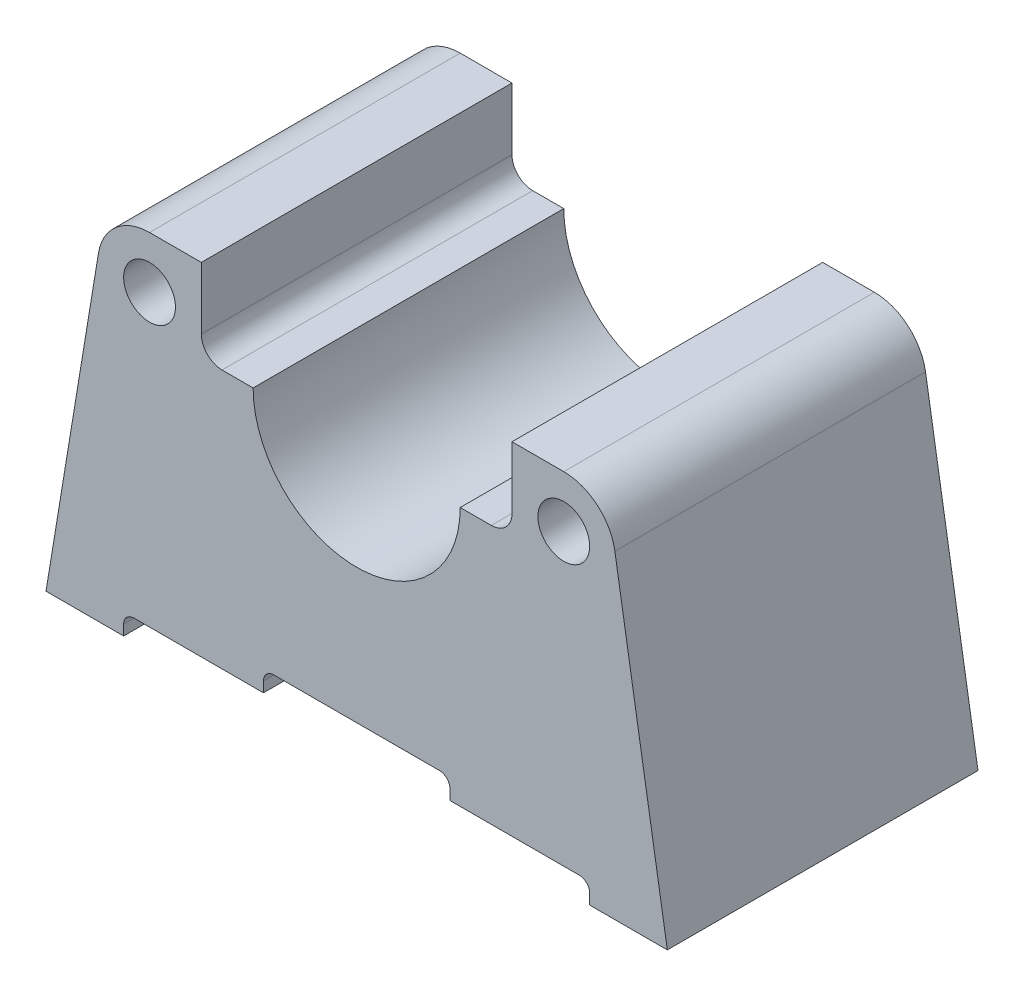
ISO-10303-21;
HEADER;
FILE_DESCRIPTION(('STEP AP214'),'2;1');
FILE_NAME('part.step','',(''),(''),'','','');
FILE_SCHEMA(('AUTOMOTIVE_DESIGN { 1 0 10303 214 1 1 1 1 }'));
ENDSEC;
DATA;
#1=APPLICATION_CONTEXT('core data for automotive mechanical design processes');
#2=APPLICATION_PROTOCOL_DEFINITION('international standard','automotive_design',2000,#1);
#3=PRODUCT_CONTEXT('',#1,'mechanical');
#4=PRODUCT('Part','Part','',(#3));
#5=PRODUCT_RELATED_PRODUCT_CATEGORY('part','',(#4));
#6=PRODUCT_DEFINITION_FORMATION('','',#4);
#7=PRODUCT_DEFINITION_CONTEXT('part definition',#1,'design');
#8=PRODUCT_DEFINITION('design','',#6,#7);
#9=PRODUCT_DEFINITION_SHAPE('','',#8);
#10=(LENGTH_UNIT() NAMED_UNIT(*) SI_UNIT(.MILLI.,.METRE.));
#11=(NAMED_UNIT(*) PLANE_ANGLE_UNIT() SI_UNIT($,.RADIAN.));
#12=(NAMED_UNIT(*) SI_UNIT($,.STERADIAN.) SOLID_ANGLE_UNIT());
#13=UNCERTAINTY_MEASURE_WITH_UNIT(LENGTH_MEASURE(1.E-05),#10,'distance_accuracy_value','');
#14=(GEOMETRIC_REPRESENTATION_CONTEXT(3) GLOBAL_UNCERTAINTY_ASSIGNED_CONTEXT((#13)) GLOBAL_UNIT_ASSIGNED_CONTEXT((#10,
#11,#12)) REPRESENTATION_CONTEXT('',''));
#15=CARTESIAN_POINT('',(0.,0.,0.));
#16=DIRECTION('',(0.,0.,1.));
#17=DIRECTION('',(1.,0.,0.));
#18=AXIS2_PLACEMENT_3D('',#15,#16,#17);
#19=CARTESIAN_POINT('',(20.,30.,30.));
#20=DIRECTION('',(0.,0.,1.));
#21=DIRECTION('',(1.,0.,0.));
#22=AXIS2_PLACEMENT_3D('',#19,#20,#21);
#23=PLANE('',#22);
#24=CARTESIAN_POINT('',(20.,30.,30.));
#25=DIRECTION('',(0.,0.,1.));
#26=DIRECTION('',(1.,0.,0.));
#27=AXIS2_PLACEMENT_3D('',#24,#25,#26);
#28=CIRCLE('',#27,2.5);
#29=CARTESIAN_POINT('',(22.5,30.,30.));
#30=VERTEX_POINT('',#29);
#31=EDGE_CURVE('E246',#30,#30,#28,.T.);
#32=ORIENTED_EDGE('',*,*,#31,.F.);
#33=EDGE_LOOP('',(#32));
#34=FACE_BOUND('',#33,.T.);
#35=DIRECTION('',(1.,0.,0.));
#36=VECTOR('',#35,1.);
#37=CARTESIAN_POINT('',(22.5,0.,30.));
#38=LINE('',#37,#36);
#39=CARTESIAN_POINT('',(22.5,0.,30.));
#40=VERTEX_POINT('',#39);
#41=CARTESIAN_POINT('',(30.,0.,30.));
#42=VERTEX_POINT('',#41);
#43=EDGE_CURVE('E293',#40,#42,#38,.T.);
#44=ORIENTED_EDGE('',*,*,#43,.T.);
#45=DIRECTION('',(-0.16224989991992,0.98674969975976,0.));
#46=VECTOR('',#45,1.);
#47=CARTESIAN_POINT('',(30.,0.,30.));
#48=LINE('',#47,#46);
#49=CARTESIAN_POINT('',(24.9337484987988,30.8112494995996,30.));
#50=VERTEX_POINT('',#49);
#51=EDGE_CURVE('E151',#42,#50,#48,.T.);
#52=ORIENTED_EDGE('',*,*,#51,.T.);
#53=CARTESIAN_POINT('',(20.,30.,30.));
#54=DIRECTION('',(0.,0.,1.));
#55=DIRECTION('',(1.,0.,0.));
#56=AXIS2_PLACEMENT_3D('',#53,#54,#55);
#57=CIRCLE('',#56,5.);
#58=CARTESIAN_POINT('',(20.,35.,30.));
#59=VERTEX_POINT('',#58);
#60=EDGE_CURVE('E362',#50,#59,#57,.T.);
#61=ORIENTED_EDGE('',*,*,#60,.T.);
#62=DIRECTION('',(-1.,0.,0.));
#63=VECTOR('',#62,1.);
#64=CARTESIAN_POINT('',(20.,35.,30.));
#65=LINE('',#64,#63);
#66=CARTESIAN_POINT('',(15.,35.,30.));
#67=VERTEX_POINT('',#66);
#68=EDGE_CURVE('E381',#59,#67,#65,.T.);
#69=ORIENTED_EDGE('',*,*,#68,.T.);
#70=DIRECTION('',(0.,-1.,0.));
#71=VECTOR('',#70,1.);
#72=CARTESIAN_POINT('',(15.,35.,30.));
#73=LINE('',#72,#71);
#74=CARTESIAN_POINT('',(15.,29.,30.));
#75=VERTEX_POINT('',#74);
#76=EDGE_CURVE('E378',#67,#75,#73,.T.);
#77=ORIENTED_EDGE('',*,*,#76,.T.);
#78=CARTESIAN_POINT('',(13.,29.,30.));
#79=DIRECTION('',(0.,0.,-1.));
#80=DIRECTION('',(-1.,0.,0.));
#81=AXIS2_PLACEMENT_3D('',#78,#79,#80);
#82=CIRCLE('',#81,2.);
#83=CARTESIAN_POINT('',(13.,27.,30.));
#84=VERTEX_POINT('',#83);
#85=EDGE_CURVE('E380',#75,#84,#82,.T.);
#86=ORIENTED_EDGE('',*,*,#85,.T.);
#87=DIRECTION('',(-1.,0.,0.));
#88=VECTOR('',#87,1.);
#89=CARTESIAN_POINT('',(13.,27.,30.));
#90=LINE('',#89,#88);
#91=CARTESIAN_POINT('',(10.,27.,30.));
#92=VERTEX_POINT('',#91);
#93=EDGE_CURVE('E383',#84,#92,#90,.T.);
#94=ORIENTED_EDGE('',*,*,#93,.T.);
#95=CARTESIAN_POINT('',(0.,27.,30.));
#96=DIRECTION('',(0.,0.,-1.));
#97=DIRECTION('',(-1.,0.,0.));
#98=AXIS2_PLACEMENT_3D('',#95,#96,#97);
#99=CIRCLE('',#98,10.);
#100=CARTESIAN_POINT('',(-10.,27.,30.));
#101=VERTEX_POINT('',#100);
#102=EDGE_CURVE('E389',#92,#101,#99,.T.);
#103=ORIENTED_EDGE('',*,*,#102,.T.);
#104=DIRECTION('',(-1.,0.,0.));
#105=VECTOR('',#104,1.);
#106=CARTESIAN_POINT('',(-13.,27.,30.));
#107=LINE('',#106,#105);
#108=CARTESIAN_POINT('',(-13.,27.,30.));
#109=VERTEX_POINT('',#108);
#110=EDGE_CURVE('E391',#101,#109,#107,.T.);
#111=ORIENTED_EDGE('',*,*,#110,.T.);
#112=CARTESIAN_POINT('',(-13.,29.,30.));
#113=DIRECTION('',(0.,0.,-1.));
#114=DIRECTION('',(-1.,0.,0.));
#115=AXIS2_PLACEMENT_3D('',#112,#113,#114);
#116=CIRCLE('',#115,2.);
#117=CARTESIAN_POINT('',(-15.,29.,30.));
#118=VERTEX_POINT('',#117);
#119=EDGE_CURVE('E393',#109,#118,#116,.T.);
#120=ORIENTED_EDGE('',*,*,#119,.T.);
#121=DIRECTION('',(0.,1.,0.));
#122=VECTOR('',#121,1.);
#123=CARTESIAN_POINT('',(-15.,35.,30.));
#124=LINE('',#123,#122);
#125=CARTESIAN_POINT('',(-15.,35.,30.));
#126=VERTEX_POINT('',#125);
#127=EDGE_CURVE('E395',#118,#126,#124,.T.);
#128=ORIENTED_EDGE('',*,*,#127,.T.);
#129=DIRECTION('',(-1.,0.,0.));
#130=VECTOR('',#129,1.);
#131=CARTESIAN_POINT('',(-20.,35.,30.));
#132=LINE('',#131,#130);
#133=CARTESIAN_POINT('',(-20.,35.,30.));
#134=VERTEX_POINT('',#133);
#135=EDGE_CURVE('E397',#126,#134,#132,.T.);
#136=ORIENTED_EDGE('',*,*,#135,.T.);
#137=CARTESIAN_POINT('',(-20.,30.,30.));
#138=DIRECTION('',(0.,0.,1.));
#139=DIRECTION('',(1.,0.,0.));
#140=AXIS2_PLACEMENT_3D('',#137,#138,#139);
#141=CIRCLE('',#140,5.);
#142=CARTESIAN_POINT('',(-24.9337484987988,30.8112494995996,30.));
#143=VERTEX_POINT('',#142);
#144=EDGE_CURVE('E399',#134,#143,#141,.T.);
#145=ORIENTED_EDGE('',*,*,#144,.T.);
#146=DIRECTION('',(-0.16224989991992,-0.98674969975976,0.));
#147=VECTOR('',#146,1.);
#148=CARTESIAN_POINT('',(-30.,0.,30.));
#149=LINE('',#148,#147);
#150=CARTESIAN_POINT('',(-30.,0.,30.));
#151=VERTEX_POINT('',#150);
#152=EDGE_CURVE('E401',#143,#151,#149,.T.);
#153=ORIENTED_EDGE('',*,*,#152,.T.);
#154=DIRECTION('',(1.,0.,0.));
#155=VECTOR('',#154,1.);
#156=CARTESIAN_POINT('',(-22.5,0.,30.));
#157=LINE('',#156,#155);
#158=CARTESIAN_POINT('',(-22.5,0.,30.));
#159=VERTEX_POINT('',#158);
#160=EDGE_CURVE('E403',#151,#159,#157,.T.);
#161=ORIENTED_EDGE('',*,*,#160,.T.);
#162=DIRECTION('',(0.,1.,0.));
#163=VECTOR('',#162,1.);
#164=CARTESIAN_POINT('',(-22.5,0.999999999999993,30.));
#165=LINE('',#164,#163);
#166=CARTESIAN_POINT('',(-22.5,0.999999999999993,30.));
#167=VERTEX_POINT('',#166);
#168=EDGE_CURVE('E405',#159,#167,#165,.T.);
#169=ORIENTED_EDGE('',*,*,#168,.T.);
#170=CARTESIAN_POINT('',(-21.5,1.,30.));
#171=DIRECTION('',(0.,0.,-1.));
#172=DIRECTION('',(-1.,0.,0.));
#173=AXIS2_PLACEMENT_3D('',#170,#171,#172);
#174=CIRCLE('',#173,1.);
#175=CARTESIAN_POINT('',(-21.5,2.,30.));
#176=VERTEX_POINT('',#175);
#177=EDGE_CURVE('E407',#167,#176,#174,.T.);
#178=ORIENTED_EDGE('',*,*,#177,.T.);
#179=DIRECTION('',(1.,0.,0.));
#180=VECTOR('',#179,1.);
#181=CARTESIAN_POINT('',(-9.,2.,30.));
#182=LINE('',#181,#180);
#183=CARTESIAN_POINT('',(-9.,2.,30.));
#184=VERTEX_POINT('',#183);
#185=EDGE_CURVE('E409',#176,#184,#182,.T.);
#186=ORIENTED_EDGE('',*,*,#185,.T.);
#187=DIRECTION('',(0.,1.,0.));
#188=VECTOR('',#187,1.);
#189=CARTESIAN_POINT('',(-9.,2.99999999999999,30.));
#190=LINE('',#189,#188);
#191=CARTESIAN_POINT('',(-9.,2.99999999999999,30.));
#192=VERTEX_POINT('',#191);
#193=EDGE_CURVE('E411',#184,#192,#190,.T.);
#194=ORIENTED_EDGE('',*,*,#193,.T.);
#195=CARTESIAN_POINT('',(-8.,3.,30.));
#196=DIRECTION('',(0.,0.,-1.));
#197=DIRECTION('',(-1.,0.,0.));
#198=AXIS2_PLACEMENT_3D('',#195,#196,#197);
#199=CIRCLE('',#198,1.);
#200=CARTESIAN_POINT('',(-7.99999999999999,4.,30.));
#201=VERTEX_POINT('',#200);
#202=EDGE_CURVE('E413',#192,#201,#199,.T.);
#203=ORIENTED_EDGE('',*,*,#202,.T.);
#204=DIRECTION('',(1.,0.,0.));
#205=VECTOR('',#204,1.);
#206=CARTESIAN_POINT('',(-7.99999999999999,4.,30.));
#207=LINE('',#206,#205);
#208=CARTESIAN_POINT('',(7.99999999999999,4.,30.));
#209=VERTEX_POINT('',#208);
#210=EDGE_CURVE('E415',#201,#209,#207,.T.);
#211=ORIENTED_EDGE('',*,*,#210,.T.);
#212=CARTESIAN_POINT('',(8.,3.,30.));
#213=DIRECTION('',(0.,0.,-1.));
#214=DIRECTION('',(-1.,0.,0.));
#215=AXIS2_PLACEMENT_3D('',#212,#213,#214);
#216=CIRCLE('',#215,1.);
#217=CARTESIAN_POINT('',(9.,2.99999999999999,30.));
#218=VERTEX_POINT('',#217);
#219=EDGE_CURVE('E417',#209,#218,#216,.T.);
#220=ORIENTED_EDGE('',*,*,#219,.T.);
#221=DIRECTION('',(0.,-1.,0.));
#222=VECTOR('',#221,1.);
#223=CARTESIAN_POINT('',(9.,2.99999999999999,30.));
#224=LINE('',#223,#222);
#225=CARTESIAN_POINT('',(9.,2.,30.));
#226=VERTEX_POINT('',#225);
#227=EDGE_CURVE('E224',#218,#226,#224,.T.);
#228=ORIENTED_EDGE('',*,*,#227,.T.);
#229=DIRECTION('',(1.,0.,0.));
#230=VECTOR('',#229,1.);
#231=CARTESIAN_POINT('',(9.,2.,30.));
#232=LINE('',#231,#230);
#233=CARTESIAN_POINT('',(21.5,2.,30.));
#234=VERTEX_POINT('',#233);
#235=EDGE_CURVE('E218',#226,#234,#232,.T.);
#236=ORIENTED_EDGE('',*,*,#235,.T.);
#237=CARTESIAN_POINT('',(21.5,1.,30.));
#238=DIRECTION('',(0.,0.,-1.));
#239=DIRECTION('',(-1.,0.,0.));
#240=AXIS2_PLACEMENT_3D('',#237,#238,#239);
#241=CIRCLE('',#240,1.);
#242=CARTESIAN_POINT('',(22.5,0.999999999999993,30.));
#243=VERTEX_POINT('',#242);
#244=EDGE_CURVE('E222',#234,#243,#241,.T.);
#245=ORIENTED_EDGE('',*,*,#244,.T.);
#246=DIRECTION('',(0.,-1.,0.));
#247=VECTOR('',#246,1.);
#248=CARTESIAN_POINT('',(22.5,0.999999999999993,30.));
#249=LINE('',#248,#247);
#250=EDGE_CURVE('E54',#243,#40,#249,.T.);
#251=ORIENTED_EDGE('',*,*,#250,.T.);
#252=EDGE_LOOP('',(#44,#52,#61,#69,#77,#86,#94,#103,#111,#120,#128,#136,#145,#153,#161,#169,
#178,#186,#194,#203,#211,#220,#228,#236,#245,#251));
#253=FACE_BOUND('',#252,.T.);
#254=CARTESIAN_POINT('',(-20.,30.,30.));
#255=DIRECTION('',(0.,0.,1.));
#256=DIRECTION('',(1.,0.,0.));
#257=AXIS2_PLACEMENT_3D('',#254,#255,#256);
#258=CIRCLE('',#257,2.5);
#259=CARTESIAN_POINT('',(-17.5,30.,30.));
#260=VERTEX_POINT('',#259);
#261=EDGE_CURVE('E459',#260,#260,#258,.T.);
#262=ORIENTED_EDGE('',*,*,#261,.F.);
#263=EDGE_LOOP('',(#262));
#264=FACE_BOUND('',#263,.T.);
#265=ADVANCED_FACE('F37',(#34,#253,#264),#23,.T.);
#266=CARTESIAN_POINT('',(20.,30.,0.));
#267=DIRECTION('',(0.,0.,1.));
#268=DIRECTION('',(1.,0.,0.));
#269=AXIS2_PLACEMENT_3D('',#266,#267,#268);
#270=PLANE('',#269);
#271=DIRECTION('',(1.,0.,0.));
#272=VECTOR('',#271,1.);
#273=CARTESIAN_POINT('',(22.5,0.,0.));
#274=LINE('',#273,#272);
#275=CARTESIAN_POINT('',(22.5,0.,0.));
#276=VERTEX_POINT('',#275);
#277=CARTESIAN_POINT('',(30.,0.,0.));
#278=VERTEX_POINT('',#277);
#279=EDGE_CURVE('E242',#276,#278,#274,.T.);
#280=ORIENTED_EDGE('',*,*,#279,.F.);
#281=DIRECTION('',(0.,-1.,0.));
#282=VECTOR('',#281,1.);
#283=CARTESIAN_POINT('',(22.5,0.999999999999993,0.));
#284=LINE('',#283,#282);
#285=CARTESIAN_POINT('',(22.5,0.999999999999993,0.));
#286=VERTEX_POINT('',#285);
#287=EDGE_CURVE('E143',#286,#276,#284,.T.);
#288=ORIENTED_EDGE('',*,*,#287,.F.);
#289=CARTESIAN_POINT('',(21.5,1.,0.));
#290=DIRECTION('',(0.,0.,-1.));
#291=DIRECTION('',(-1.,0.,0.));
#292=AXIS2_PLACEMENT_3D('',#289,#290,#291);
#293=CIRCLE('',#292,1.);
#294=CARTESIAN_POINT('',(21.5,2.,0.));
#295=VERTEX_POINT('',#294);
#296=EDGE_CURVE('E137',#295,#286,#293,.T.);
#297=ORIENTED_EDGE('',*,*,#296,.F.);
#298=DIRECTION('',(1.,0.,0.));
#299=VECTOR('',#298,1.);
#300=CARTESIAN_POINT('',(9.,2.,0.));
#301=LINE('',#300,#299);
#302=CARTESIAN_POINT('',(9.,2.,0.));
#303=VERTEX_POINT('',#302);
#304=EDGE_CURVE('E232',#303,#295,#301,.T.);
#305=ORIENTED_EDGE('',*,*,#304,.F.);
#306=DIRECTION('',(0.,-1.,0.));
#307=VECTOR('',#306,1.);
#308=CARTESIAN_POINT('',(9.,2.99999999999999,0.));
#309=LINE('',#308,#307);
#310=CARTESIAN_POINT('',(9.,2.99999999999999,0.));
#311=VERTEX_POINT('',#310);
#312=EDGE_CURVE('E288',#311,#303,#309,.T.);
#313=ORIENTED_EDGE('',*,*,#312,.F.);
#314=CARTESIAN_POINT('',(8.,3.,0.));
#315=DIRECTION('',(0.,0.,-1.));
#316=DIRECTION('',(-1.,0.,0.));
#317=AXIS2_PLACEMENT_3D('',#314,#315,#316);
#318=CIRCLE('',#317,1.);
#319=CARTESIAN_POINT('',(7.99999999999999,4.,0.));
#320=VERTEX_POINT('',#319);
#321=EDGE_CURVE('E286',#320,#311,#318,.T.);
#322=ORIENTED_EDGE('',*,*,#321,.F.);
#323=DIRECTION('',(1.,0.,0.));
#324=VECTOR('',#323,1.);
#325=CARTESIAN_POINT('',(-7.99999999999999,4.,0.));
#326=LINE('',#325,#324);
#327=CARTESIAN_POINT('',(-7.99999999999999,4.,0.));
#328=VERTEX_POINT('',#327);
#329=EDGE_CURVE('E284',#328,#320,#326,.T.);
#330=ORIENTED_EDGE('',*,*,#329,.F.);
#331=CARTESIAN_POINT('',(-8.,3.,0.));
#332=DIRECTION('',(0.,0.,-1.));
#333=DIRECTION('',(-1.,0.,0.));
#334=AXIS2_PLACEMENT_3D('',#331,#332,#333);
#335=CIRCLE('',#334,1.);
#336=CARTESIAN_POINT('',(-9.,2.99999999999999,0.));
#337=VERTEX_POINT('',#336);
#338=EDGE_CURVE('E282',#337,#328,#335,.T.);
#339=ORIENTED_EDGE('',*,*,#338,.F.);
#340=DIRECTION('',(0.,1.,0.));
#341=VECTOR('',#340,1.);
#342=CARTESIAN_POINT('',(-9.,2.99999999999999,0.));
#343=LINE('',#342,#341);
#344=CARTESIAN_POINT('',(-9.,2.,0.));
#345=VERTEX_POINT('',#344);
#346=EDGE_CURVE('E280',#345,#337,#343,.T.);
#347=ORIENTED_EDGE('',*,*,#346,.F.);
#348=DIRECTION('',(1.,0.,0.));
#349=VECTOR('',#348,1.);
#350=CARTESIAN_POINT('',(-9.,2.,0.));
#351=LINE('',#350,#349);
#352=CARTESIAN_POINT('',(-21.5,2.,0.));
#353=VERTEX_POINT('',#352);
#354=EDGE_CURVE('E278',#353,#345,#351,.T.);
#355=ORIENTED_EDGE('',*,*,#354,.F.);
#356=CARTESIAN_POINT('',(-21.5,1.,0.));
#357=DIRECTION('',(0.,0.,-1.));
#358=DIRECTION('',(-1.,0.,0.));
#359=AXIS2_PLACEMENT_3D('',#356,#357,#358);
#360=CIRCLE('',#359,1.);
#361=CARTESIAN_POINT('',(-22.5,0.999999999999993,0.));
#362=VERTEX_POINT('',#361);
#363=EDGE_CURVE('E276',#362,#353,#360,.T.);
#364=ORIENTED_EDGE('',*,*,#363,.F.);
#365=DIRECTION('',(0.,1.,0.));
#366=VECTOR('',#365,1.);
#367=CARTESIAN_POINT('',(-22.5,0.999999999999993,0.));
#368=LINE('',#367,#366);
#369=CARTESIAN_POINT('',(-22.5,0.,0.));
#370=VERTEX_POINT('',#369);
#371=EDGE_CURVE('E274',#370,#362,#368,.T.);
#372=ORIENTED_EDGE('',*,*,#371,.F.);
#373=DIRECTION('',(1.,0.,0.));
#374=VECTOR('',#373,1.);
#375=CARTESIAN_POINT('',(-22.5,0.,0.));
#376=LINE('',#375,#374);
#377=CARTESIAN_POINT('',(-30.,0.,0.));
#378=VERTEX_POINT('',#377);
#379=EDGE_CURVE('E272',#378,#370,#376,.T.);
#380=ORIENTED_EDGE('',*,*,#379,.F.);
#381=DIRECTION('',(-0.16224989991992,-0.98674969975976,0.));
#382=VECTOR('',#381,1.);
#383=CARTESIAN_POINT('',(-30.,0.,0.));
#384=LINE('',#383,#382);
#385=CARTESIAN_POINT('',(-24.9337484987988,30.8112494995996,0.));
#386=VERTEX_POINT('',#385);
#387=EDGE_CURVE('E270',#386,#378,#384,.T.);
#388=ORIENTED_EDGE('',*,*,#387,.F.);
#389=CARTESIAN_POINT('',(-20.,30.,0.));
#390=DIRECTION('',(0.,0.,1.));
#391=DIRECTION('',(1.,0.,0.));
#392=AXIS2_PLACEMENT_3D('',#389,#390,#391);
#393=CIRCLE('',#392,5.);
#394=CARTESIAN_POINT('',(-20.,35.,0.));
#395=VERTEX_POINT('',#394);
#396=EDGE_CURVE('E268',#395,#386,#393,.T.);
#397=ORIENTED_EDGE('',*,*,#396,.F.);
#398=DIRECTION('',(-1.,0.,0.));
#399=VECTOR('',#398,1.);
#400=CARTESIAN_POINT('',(-20.,35.,0.));
#401=LINE('',#400,#399);
#402=CARTESIAN_POINT('',(-15.,35.,0.));
#403=VERTEX_POINT('',#402);
#404=EDGE_CURVE('E266',#403,#395,#401,.T.);
#405=ORIENTED_EDGE('',*,*,#404,.F.);
#406=DIRECTION('',(0.,1.,0.));
#407=VECTOR('',#406,1.);
#408=CARTESIAN_POINT('',(-15.,35.,0.));
#409=LINE('',#408,#407);
#410=CARTESIAN_POINT('',(-15.,29.,0.));
#411=VERTEX_POINT('',#410);
#412=EDGE_CURVE('E264',#411,#403,#409,.T.);
#413=ORIENTED_EDGE('',*,*,#412,.F.);
#414=CARTESIAN_POINT('',(-13.,29.,0.));
#415=DIRECTION('',(0.,0.,-1.));
#416=DIRECTION('',(-1.,0.,0.));
#417=AXIS2_PLACEMENT_3D('',#414,#415,#416);
#418=CIRCLE('',#417,2.);
#419=CARTESIAN_POINT('',(-13.,27.,0.));
#420=VERTEX_POINT('',#419);
#421=EDGE_CURVE('E262',#420,#411,#418,.T.);
#422=ORIENTED_EDGE('',*,*,#421,.F.);
#423=DIRECTION('',(-1.,0.,0.));
#424=VECTOR('',#423,1.);
#425=CARTESIAN_POINT('',(-13.,27.,0.));
#426=LINE('',#425,#424);
#427=CARTESIAN_POINT('',(-10.,27.,0.));
#428=VERTEX_POINT('',#427);
#429=EDGE_CURVE('E260',#428,#420,#426,.T.);
#430=ORIENTED_EDGE('',*,*,#429,.F.);
#431=CARTESIAN_POINT('',(0.,27.,0.));
#432=DIRECTION('',(0.,0.,-1.));
#433=DIRECTION('',(-1.,0.,0.));
#434=AXIS2_PLACEMENT_3D('',#431,#432,#433);
#435=CIRCLE('',#434,10.);
#436=CARTESIAN_POINT('',(10.,27.,0.));
#437=VERTEX_POINT('',#436);
#438=EDGE_CURVE('E258',#437,#428,#435,.T.);
#439=ORIENTED_EDGE('',*,*,#438,.F.);
#440=DIRECTION('',(-1.,0.,0.));
#441=VECTOR('',#440,1.);
#442=CARTESIAN_POINT('',(13.,27.,0.));
#443=LINE('',#442,#441);
#444=CARTESIAN_POINT('',(13.,27.,0.));
#445=VERTEX_POINT('',#444);
#446=EDGE_CURVE('E256',#445,#437,#443,.T.);
#447=ORIENTED_EDGE('',*,*,#446,.F.);
#448=CARTESIAN_POINT('',(13.,29.,0.));
#449=DIRECTION('',(0.,0.,-1.));
#450=DIRECTION('',(-1.,0.,0.));
#451=AXIS2_PLACEMENT_3D('',#448,#449,#450);
#452=CIRCLE('',#451,2.);
#453=CARTESIAN_POINT('',(15.,29.,0.));
#454=VERTEX_POINT('',#453);
#455=EDGE_CURVE('E254',#454,#445,#452,.T.);
#456=ORIENTED_EDGE('',*,*,#455,.F.);
#457=DIRECTION('',(0.,-1.,0.));
#458=VECTOR('',#457,1.);
#459=CARTESIAN_POINT('',(15.,35.,0.));
#460=LINE('',#459,#458);
#461=CARTESIAN_POINT('',(15.,35.,0.));
#462=VERTEX_POINT('',#461);
#463=EDGE_CURVE('E252',#462,#454,#460,.T.);
#464=ORIENTED_EDGE('',*,*,#463,.F.);
#465=DIRECTION('',(-1.,0.,0.));
#466=VECTOR('',#465,1.);
#467=CARTESIAN_POINT('',(20.,35.,0.));
#468=LINE('',#467,#466);
#469=CARTESIAN_POINT('',(20.,35.,0.));
#470=VERTEX_POINT('',#469);
#471=EDGE_CURVE('E250',#470,#462,#468,.T.);
#472=ORIENTED_EDGE('',*,*,#471,.F.);
#473=CARTESIAN_POINT('',(20.,30.,0.));
#474=DIRECTION('',(0.,0.,1.));
#475=DIRECTION('',(1.,0.,0.));
#476=AXIS2_PLACEMENT_3D('',#473,#474,#475);
#477=CIRCLE('',#476,5.);
#478=CARTESIAN_POINT('',(24.9337484987988,30.8112494995996,0.));
#479=VERTEX_POINT('',#478);
#480=EDGE_CURVE('E248',#479,#470,#477,.T.);
#481=ORIENTED_EDGE('',*,*,#480,.F.);
#482=DIRECTION('',(-0.16224989991992,0.98674969975976,0.));
#483=VECTOR('',#482,1.);
#484=CARTESIAN_POINT('',(30.,0.,0.));
#485=LINE('',#484,#483);
#486=EDGE_CURVE('E245',#278,#479,#485,.T.);
#487=ORIENTED_EDGE('',*,*,#486,.F.);
#488=EDGE_LOOP('',(#280,#288,#297,#305,#313,#322,#330,#339,#347,#355,#364,#372,#380,#388,#397,
#405,#413,#422,#430,#439,#447,#456,#464,#472,#481,#487));
#489=FACE_BOUND('',#488,.T.);
#490=CARTESIAN_POINT('',(20.,30.,0.));
#491=DIRECTION('',(0.,0.,1.));
#492=DIRECTION('',(1.,0.,0.));
#493=AXIS2_PLACEMENT_3D('',#490,#491,#492);
#494=CIRCLE('',#493,2.5);
#495=CARTESIAN_POINT('',(22.5,30.,0.));
#496=VERTEX_POINT('',#495);
#497=EDGE_CURVE('E465',#496,#496,#494,.T.);
#498=ORIENTED_EDGE('',*,*,#497,.T.);
#499=EDGE_LOOP('',(#498));
#500=FACE_BOUND('',#499,.T.);
#501=CARTESIAN_POINT('',(-20.,30.,0.));
#502=DIRECTION('',(0.,0.,1.));
#503=DIRECTION('',(1.,0.,0.));
#504=AXIS2_PLACEMENT_3D('',#501,#502,#503);
#505=CIRCLE('',#504,2.5);
#506=CARTESIAN_POINT('',(-17.5,30.,0.));
#507=VERTEX_POINT('',#506);
#508=EDGE_CURVE('E462',#507,#507,#505,.T.);
#509=ORIENTED_EDGE('',*,*,#508,.T.);
#510=EDGE_LOOP('',(#509));
#511=FACE_BOUND('',#510,.T.);
#512=ADVANCED_FACE('F366',(#489,#500,#511),#270,.F.);
#513=CARTESIAN_POINT('',(22.5,0.,30.));
#514=DIRECTION('',(0.,1.,0.));
#515=DIRECTION('',(-1.,0.,0.));
#516=AXIS2_PLACEMENT_3D('',#513,#514,#515);
#517=PLANE('',#516);
#518=ORIENTED_EDGE('',*,*,#279,.T.);
#519=DIRECTION('',(0.,0.,-1.));
#520=VECTOR('',#519,1.);
#521=CARTESIAN_POINT('',(30.,0.,30.));
#522=LINE('',#521,#520);
#523=EDGE_CURVE('E11',#42,#278,#522,.T.);
#524=ORIENTED_EDGE('',*,*,#523,.F.);
#525=ORIENTED_EDGE('',*,*,#43,.F.);
#526=DIRECTION('',(0.,0.,-1.));
#527=VECTOR('',#526,1.);
#528=CARTESIAN_POINT('',(22.5,0.,30.));
#529=LINE('',#528,#527);
#530=EDGE_CURVE('E238',#40,#276,#529,.T.);
#531=ORIENTED_EDGE('',*,*,#530,.T.);
#532=EDGE_LOOP('',(#518,#524,#525,#531));
#533=FACE_BOUND('',#532,.T.);
#534=ADVANCED_FACE('F39',(#533),#517,.F.);
#535=CARTESIAN_POINT('',(30.,0.,30.));
#536=DIRECTION('',(-0.98674969975976,-0.16224989991992,0.));
#537=DIRECTION('',(0.16224989991992,-0.98674969975976,0.));
#538=AXIS2_PLACEMENT_3D('',#535,#536,#537);
#539=PLANE('',#538);
#540=ORIENTED_EDGE('',*,*,#486,.T.);
#541=DIRECTION('',(0.,0.,-1.));
#542=VECTOR('',#541,1.);
#543=CARTESIAN_POINT('',(24.9337484987988,30.8112494995996,30.));
#544=LINE('',#543,#542);
#545=EDGE_CURVE('E46',#50,#479,#544,.T.);
#546=ORIENTED_EDGE('',*,*,#545,.F.);
#547=ORIENTED_EDGE('',*,*,#51,.F.);
#548=ORIENTED_EDGE('',*,*,#523,.T.);
#549=EDGE_LOOP('',(#540,#546,#547,#548));
#550=FACE_BOUND('',#549,.T.);
#551=ADVANCED_FACE('F722',(#550),#539,.F.);
#552=CARTESIAN_POINT('',(20.,30.,30.));
#553=DIRECTION('',(0.,0.,-1.));
#554=DIRECTION('',(-1.,0.,0.));
#555=AXIS2_PLACEMENT_3D('',#552,#553,#554);
#556=CYLINDRICAL_SURFACE('',#555,5.);
#557=ORIENTED_EDGE('',*,*,#480,.T.);
#558=DIRECTION('',(0.,0.,-1.));
#559=VECTOR('',#558,1.);
#560=CARTESIAN_POINT('',(20.,35.,30.));
#561=LINE('',#560,#559);
#562=EDGE_CURVE('E354',#59,#470,#561,.T.);
#563=ORIENTED_EDGE('',*,*,#562,.F.);
#564=ORIENTED_EDGE('',*,*,#60,.F.);
#565=ORIENTED_EDGE('',*,*,#545,.T.);
#566=EDGE_LOOP('',(#557,#563,#564,#565));
#567=FACE_BOUND('',#566,.T.);
#568=ADVANCED_FACE('F360',(#567),#556,.T.);
#569=CARTESIAN_POINT('',(20.,35.,30.));
#570=DIRECTION('',(0.,-1.,0.));
#571=DIRECTION('',(0.,0.,-1.));
#572=AXIS2_PLACEMENT_3D('',#569,#570,#571);
#573=PLANE('',#572);
#574=ORIENTED_EDGE('',*,*,#471,.T.);
#575=DIRECTION('',(0.,0.,-1.));
#576=VECTOR('',#575,1.);
#577=CARTESIAN_POINT('',(15.,35.,30.));
#578=LINE('',#577,#576);
#579=EDGE_CURVE('E351',#67,#462,#578,.T.);
#580=ORIENTED_EDGE('',*,*,#579,.F.);
#581=ORIENTED_EDGE('',*,*,#68,.F.);
#582=ORIENTED_EDGE('',*,*,#562,.T.);
#583=EDGE_LOOP('',(#574,#580,#581,#582));
#584=FACE_BOUND('',#583,.T.);
#585=ADVANCED_FACE('F372',(#584),#573,.F.);
#586=CARTESIAN_POINT('',(15.,35.,30.));
#587=DIRECTION('',(1.,0.,0.));
#588=DIRECTION('',(0.,0.,-1.));
#589=AXIS2_PLACEMENT_3D('',#586,#587,#588);
#590=PLANE('',#589);
#591=ORIENTED_EDGE('',*,*,#463,.T.);
#592=DIRECTION('',(0.,0.,-1.));
#593=VECTOR('',#592,1.);
#594=CARTESIAN_POINT('',(15.,29.,30.));
#595=LINE('',#594,#593);
#596=EDGE_CURVE('E348',#75,#454,#595,.T.);
#597=ORIENTED_EDGE('',*,*,#596,.F.);
#598=ORIENTED_EDGE('',*,*,#76,.F.);
#599=ORIENTED_EDGE('',*,*,#579,.T.);
#600=EDGE_LOOP('',(#591,#597,#598,#599));
#601=FACE_BOUND('',#600,.T.);
#602=ADVANCED_FACE('F376',(#601),#590,.F.);
#603=CARTESIAN_POINT('',(13.,29.,30.));
#604=DIRECTION('',(0.,0.,-1.));
#605=DIRECTION('',(-1.,0.,0.));
#606=AXIS2_PLACEMENT_3D('',#603,#604,#605);
#607=CYLINDRICAL_SURFACE('',#606,2.);
#608=ORIENTED_EDGE('',*,*,#455,.T.);
#609=DIRECTION('',(0.,0.,-1.));
#610=VECTOR('',#609,1.);
#611=CARTESIAN_POINT('',(13.,27.,30.));
#612=LINE('',#611,#610);
#613=EDGE_CURVE('E345',#84,#445,#612,.T.);
#614=ORIENTED_EDGE('',*,*,#613,.F.);
#615=ORIENTED_EDGE('',*,*,#85,.F.);
#616=ORIENTED_EDGE('',*,*,#596,.T.);
#617=EDGE_LOOP('',(#608,#614,#615,#616));
#618=FACE_BOUND('',#617,.T.);
#619=ADVANCED_FACE('F683',(#618),#607,.F.);
#620=CARTESIAN_POINT('',(13.,27.,30.));
#621=DIRECTION('',(0.,-1.,0.));
#622=DIRECTION('',(1.,0.,0.));
#623=AXIS2_PLACEMENT_3D('',#620,#621,#622);
#624=PLANE('',#623);
#625=ORIENTED_EDGE('',*,*,#446,.T.);
#626=DIRECTION('',(0.,0.,-1.));
#627=VECTOR('',#626,1.);
#628=CARTESIAN_POINT('',(10.,27.,30.));
#629=LINE('',#628,#627);
#630=EDGE_CURVE('E342',#92,#437,#629,.T.);
#631=ORIENTED_EDGE('',*,*,#630,.F.);
#632=ORIENTED_EDGE('',*,*,#93,.F.);
#633=ORIENTED_EDGE('',*,*,#613,.T.);
#634=EDGE_LOOP('',(#625,#631,#632,#633));
#635=FACE_BOUND('',#634,.T.);
#636=ADVANCED_FACE('F672',(#635),#624,.F.);
#637=CARTESIAN_POINT('',(0.,27.,30.));
#638=DIRECTION('',(0.,0.,-1.));
#639=DIRECTION('',(-1.,0.,0.));
#640=AXIS2_PLACEMENT_3D('',#637,#638,#639);
#641=CYLINDRICAL_SURFACE('',#640,10.);
#642=ORIENTED_EDGE('',*,*,#438,.T.);
#643=DIRECTION('',(0.,0.,-1.));
#644=VECTOR('',#643,1.);
#645=CARTESIAN_POINT('',(-10.,27.,30.));
#646=LINE('',#645,#644);
#647=EDGE_CURVE('E339',#101,#428,#646,.T.);
#648=ORIENTED_EDGE('',*,*,#647,.F.);
#649=ORIENTED_EDGE('',*,*,#102,.F.);
#650=ORIENTED_EDGE('',*,*,#630,.T.);
#651=EDGE_LOOP('',(#642,#648,#649,#650));
#652=FACE_BOUND('',#651,.T.);
#653=ADVANCED_FACE('F661',(#652),#641,.F.);
#654=CARTESIAN_POINT('',(-13.,27.,30.));
#655=DIRECTION('',(0.,-1.,0.));
#656=DIRECTION('',(1.,0.,0.));
#657=AXIS2_PLACEMENT_3D('',#654,#655,#656);
#658=PLANE('',#657);
#659=ORIENTED_EDGE('',*,*,#429,.T.);
#660=DIRECTION('',(0.,0.,-1.));
#661=VECTOR('',#660,1.);
#662=CARTESIAN_POINT('',(-13.,27.,30.));
#663=LINE('',#662,#661);
#664=EDGE_CURVE('E336',#109,#420,#663,.T.);
#665=ORIENTED_EDGE('',*,*,#664,.F.);
#666=ORIENTED_EDGE('',*,*,#110,.F.);
#667=ORIENTED_EDGE('',*,*,#647,.T.);
#668=EDGE_LOOP('',(#659,#665,#666,#667));
#669=FACE_BOUND('',#668,.T.);
#670=ADVANCED_FACE('F650',(#669),#658,.F.);
#671=CARTESIAN_POINT('',(-13.,29.,30.));
#672=DIRECTION('',(0.,0.,-1.));
#673=DIRECTION('',(-1.,0.,0.));
#674=AXIS2_PLACEMENT_3D('',#671,#672,#673);
#675=CYLINDRICAL_SURFACE('',#674,2.);
#676=ORIENTED_EDGE('',*,*,#421,.T.);
#677=DIRECTION('',(0.,0.,-1.));
#678=VECTOR('',#677,1.);
#679=CARTESIAN_POINT('',(-15.,29.,30.));
#680=LINE('',#679,#678);
#681=EDGE_CURVE('E333',#118,#411,#680,.T.);
#682=ORIENTED_EDGE('',*,*,#681,.F.);
#683=ORIENTED_EDGE('',*,*,#119,.F.);
#684=ORIENTED_EDGE('',*,*,#664,.T.);
#685=EDGE_LOOP('',(#676,#682,#683,#684));
#686=FACE_BOUND('',#685,.T.);
#687=ADVANCED_FACE('F639',(#686),#675,.F.);
#688=CARTESIAN_POINT('',(-15.,35.,30.));
#689=DIRECTION('',(-1.,0.,0.));
#690=DIRECTION('',(0.,0.,1.));
#691=AXIS2_PLACEMENT_3D('',#688,#689,#690);
#692=PLANE('',#691);
#693=ORIENTED_EDGE('',*,*,#412,.T.);
#694=DIRECTION('',(0.,0.,-1.));
#695=VECTOR('',#694,1.);
#696=CARTESIAN_POINT('',(-15.,35.,30.));
#697=LINE('',#696,#695);
#698=EDGE_CURVE('E330',#126,#403,#697,.T.);
#699=ORIENTED_EDGE('',*,*,#698,.F.);
#700=ORIENTED_EDGE('',*,*,#127,.F.);
#701=ORIENTED_EDGE('',*,*,#681,.T.);
#702=EDGE_LOOP('',(#693,#699,#700,#701));
#703=FACE_BOUND('',#702,.T.);
#704=ADVANCED_FACE('F628',(#703),#692,.F.);
#705=CARTESIAN_POINT('',(-20.,35.,30.));
#706=DIRECTION('',(0.,-1.,0.));
#707=DIRECTION('',(0.,0.,-1.));
#708=AXIS2_PLACEMENT_3D('',#705,#706,#707);
#709=PLANE('',#708);
#710=ORIENTED_EDGE('',*,*,#404,.T.);
#711=DIRECTION('',(0.,0.,-1.));
#712=VECTOR('',#711,1.);
#713=CARTESIAN_POINT('',(-20.,35.,30.));
#714=LINE('',#713,#712);
#715=EDGE_CURVE('E327',#134,#395,#714,.T.);
#716=ORIENTED_EDGE('',*,*,#715,.F.);
#717=ORIENTED_EDGE('',*,*,#135,.F.);
#718=ORIENTED_EDGE('',*,*,#698,.T.);
#719=EDGE_LOOP('',(#710,#716,#717,#718));
#720=FACE_BOUND('',#719,.T.);
#721=ADVANCED_FACE('F617',(#720),#709,.F.);
#722=CARTESIAN_POINT('',(-20.,30.,30.));
#723=DIRECTION('',(0.,0.,-1.));
#724=DIRECTION('',(-1.,0.,0.));
#725=AXIS2_PLACEMENT_3D('',#722,#723,#724);
#726=CYLINDRICAL_SURFACE('',#725,5.);
#727=ORIENTED_EDGE('',*,*,#396,.T.);
#728=DIRECTION('',(0.,0.,-1.));
#729=VECTOR('',#728,1.);
#730=CARTESIAN_POINT('',(-24.9337484987988,30.8112494995996,30.));
#731=LINE('',#730,#729);
#732=EDGE_CURVE('E324',#143,#386,#731,.T.);
#733=ORIENTED_EDGE('',*,*,#732,.F.);
#734=ORIENTED_EDGE('',*,*,#144,.F.);
#735=ORIENTED_EDGE('',*,*,#715,.T.);
#736=EDGE_LOOP('',(#727,#733,#734,#735));
#737=FACE_BOUND('',#736,.T.);
#738=ADVANCED_FACE('F606',(#737),#726,.T.);
#739=CARTESIAN_POINT('',(-30.,0.,30.));
#740=DIRECTION('',(0.98674969975976,-0.16224989991992,0.));
#741=DIRECTION('',(0.16224989991992,0.98674969975976,0.));
#742=AXIS2_PLACEMENT_3D('',#739,#740,#741);
#743=PLANE('',#742);
#744=ORIENTED_EDGE('',*,*,#387,.T.);
#745=DIRECTION('',(0.,0.,-1.));
#746=VECTOR('',#745,1.);
#747=CARTESIAN_POINT('',(-30.,0.,30.));
#748=LINE('',#747,#746);
#749=EDGE_CURVE('E321',#151,#378,#748,.T.);
#750=ORIENTED_EDGE('',*,*,#749,.F.);
#751=ORIENTED_EDGE('',*,*,#152,.F.);
#752=ORIENTED_EDGE('',*,*,#732,.T.);
#753=EDGE_LOOP('',(#744,#750,#751,#752));
#754=FACE_BOUND('',#753,.T.);
#755=ADVANCED_FACE('F595',(#754),#743,.F.);
#756=CARTESIAN_POINT('',(-22.5,0.,30.));
#757=DIRECTION('',(0.,1.,0.));
#758=DIRECTION('',(-1.,0.,0.));
#759=AXIS2_PLACEMENT_3D('',#756,#757,#758);
#760=PLANE('',#759);
#761=ORIENTED_EDGE('',*,*,#379,.T.);
#762=DIRECTION('',(0.,0.,-1.));
#763=VECTOR('',#762,1.);
#764=CARTESIAN_POINT('',(-22.5,0.,30.));
#765=LINE('',#764,#763);
#766=EDGE_CURVE('E318',#159,#370,#765,.T.);
#767=ORIENTED_EDGE('',*,*,#766,.F.);
#768=ORIENTED_EDGE('',*,*,#160,.F.);
#769=ORIENTED_EDGE('',*,*,#749,.T.);
#770=EDGE_LOOP('',(#761,#767,#768,#769));
#771=FACE_BOUND('',#770,.T.);
#772=ADVANCED_FACE('F584',(#771),#760,.F.);
#773=CARTESIAN_POINT('',(-22.5,0.999999999999993,30.));
#774=DIRECTION('',(-1.,0.,0.));
#775=DIRECTION('',(0.,0.,1.));
#776=AXIS2_PLACEMENT_3D('',#773,#774,#775);
#777=PLANE('',#776);
#778=ORIENTED_EDGE('',*,*,#371,.T.);
#779=DIRECTION('',(0.,0.,-1.));
#780=VECTOR('',#779,1.);
#781=CARTESIAN_POINT('',(-22.5,0.999999999999993,30.));
#782=LINE('',#781,#780);
#783=EDGE_CURVE('E315',#167,#362,#782,.T.);
#784=ORIENTED_EDGE('',*,*,#783,.F.);
#785=ORIENTED_EDGE('',*,*,#168,.F.);
#786=ORIENTED_EDGE('',*,*,#766,.T.);
#787=EDGE_LOOP('',(#778,#784,#785,#786));
#788=FACE_BOUND('',#787,.T.);
#789=ADVANCED_FACE('F573',(#788),#777,.F.);
#790=CARTESIAN_POINT('',(-21.5,1.,30.));
#791=DIRECTION('',(0.,0.,-1.));
#792=DIRECTION('',(-1.,0.,0.));
#793=AXIS2_PLACEMENT_3D('',#790,#791,#792);
#794=CYLINDRICAL_SURFACE('',#793,1.);
#795=ORIENTED_EDGE('',*,*,#363,.T.);
#796=DIRECTION('',(0.,0.,-1.));
#797=VECTOR('',#796,1.);
#798=CARTESIAN_POINT('',(-21.5,2.,30.));
#799=LINE('',#798,#797);
#800=EDGE_CURVE('E312',#176,#353,#799,.T.);
#801=ORIENTED_EDGE('',*,*,#800,.F.);
#802=ORIENTED_EDGE('',*,*,#177,.F.);
#803=ORIENTED_EDGE('',*,*,#783,.T.);
#804=EDGE_LOOP('',(#795,#801,#802,#803));
#805=FACE_BOUND('',#804,.T.);
#806=ADVANCED_FACE('F562',(#805),#794,.F.);
#807=CARTESIAN_POINT('',(-9.,2.,30.));
#808=DIRECTION('',(0.,1.,0.));
#809=DIRECTION('',(0.,0.,1.));
#810=AXIS2_PLACEMENT_3D('',#807,#808,#809);
#811=PLANE('',#810);
#812=ORIENTED_EDGE('',*,*,#354,.T.);
#813=DIRECTION('',(0.,0.,-1.));
#814=VECTOR('',#813,1.);
#815=CARTESIAN_POINT('',(-9.,2.,30.));
#816=LINE('',#815,#814);
#817=EDGE_CURVE('E309',#184,#345,#816,.T.);
#818=ORIENTED_EDGE('',*,*,#817,.F.);
#819=ORIENTED_EDGE('',*,*,#185,.F.);
#820=ORIENTED_EDGE('',*,*,#800,.T.);
#821=EDGE_LOOP('',(#812,#818,#819,#820));
#822=FACE_BOUND('',#821,.T.);
#823=ADVANCED_FACE('F551',(#822),#811,.F.);
#824=CARTESIAN_POINT('',(-9.,2.99999999999999,30.));
#825=DIRECTION('',(-1.,0.,0.));
#826=DIRECTION('',(0.,0.,1.));
#827=AXIS2_PLACEMENT_3D('',#824,#825,#826);
#828=PLANE('',#827);
#829=ORIENTED_EDGE('',*,*,#346,.T.);
#830=DIRECTION('',(0.,0.,-1.));
#831=VECTOR('',#830,1.);
#832=CARTESIAN_POINT('',(-9.,2.99999999999999,30.));
#833=LINE('',#832,#831);
#834=EDGE_CURVE('E306',#192,#337,#833,.T.);
#835=ORIENTED_EDGE('',*,*,#834,.F.);
#836=ORIENTED_EDGE('',*,*,#193,.F.);
#837=ORIENTED_EDGE('',*,*,#817,.T.);
#838=EDGE_LOOP('',(#829,#835,#836,#837));
#839=FACE_BOUND('',#838,.T.);
#840=ADVANCED_FACE('F540',(#839),#828,.F.);
#841=CARTESIAN_POINT('',(-8.,3.,30.));
#842=DIRECTION('',(0.,0.,-1.));
#843=DIRECTION('',(-1.,0.,0.));
#844=AXIS2_PLACEMENT_3D('',#841,#842,#843);
#845=CYLINDRICAL_SURFACE('',#844,1.);
#846=ORIENTED_EDGE('',*,*,#338,.T.);
#847=DIRECTION('',(0.,0.,-1.));
#848=VECTOR('',#847,1.);
#849=CARTESIAN_POINT('',(-7.99999999999999,4.,30.));
#850=LINE('',#849,#848);
#851=EDGE_CURVE('E303',#201,#328,#850,.T.);
#852=ORIENTED_EDGE('',*,*,#851,.F.);
#853=ORIENTED_EDGE('',*,*,#202,.F.);
#854=ORIENTED_EDGE('',*,*,#834,.T.);
#855=EDGE_LOOP('',(#846,#852,#853,#854));
#856=FACE_BOUND('',#855,.T.);
#857=ADVANCED_FACE('F529',(#856),#845,.F.);
#858=CARTESIAN_POINT('',(-7.99999999999999,4.,30.));
#859=DIRECTION('',(0.,1.,0.));
#860=DIRECTION('',(0.,0.,1.));
#861=AXIS2_PLACEMENT_3D('',#858,#859,#860);
#862=PLANE('',#861);
#863=ORIENTED_EDGE('',*,*,#329,.T.);
#864=DIRECTION('',(0.,0.,-1.));
#865=VECTOR('',#864,1.);
#866=CARTESIAN_POINT('',(7.99999999999999,4.,30.));
#867=LINE('',#866,#865);
#868=EDGE_CURVE('E300',#209,#320,#867,.T.);
#869=ORIENTED_EDGE('',*,*,#868,.F.);
#870=ORIENTED_EDGE('',*,*,#210,.F.);
#871=ORIENTED_EDGE('',*,*,#851,.T.);
#872=EDGE_LOOP('',(#863,#869,#870,#871));
#873=FACE_BOUND('',#872,.T.);
#874=ADVANCED_FACE('F519',(#873),#862,.F.);
#875=CARTESIAN_POINT('',(8.,3.,30.));
#876=DIRECTION('',(0.,0.,-1.));
#877=DIRECTION('',(-1.,0.,0.));
#878=AXIS2_PLACEMENT_3D('',#875,#876,#877);
#879=CYLINDRICAL_SURFACE('',#878,1.);
#880=ORIENTED_EDGE('',*,*,#321,.T.);
#881=DIRECTION('',(0.,0.,-1.));
#882=VECTOR('',#881,1.);
#883=CARTESIAN_POINT('',(9.,2.99999999999999,30.));
#884=LINE('',#883,#882);
#885=EDGE_CURVE('E297',#218,#311,#884,.T.);
#886=ORIENTED_EDGE('',*,*,#885,.F.);
#887=ORIENTED_EDGE('',*,*,#219,.F.);
#888=ORIENTED_EDGE('',*,*,#868,.T.);
#889=EDGE_LOOP('',(#880,#886,#887,#888));
#890=FACE_BOUND('',#889,.T.);
#891=ADVANCED_FACE('F423',(#890),#879,.F.);
#892=CARTESIAN_POINT('',(9.,2.99999999999999,30.));
#893=DIRECTION('',(1.,0.,0.));
#894=DIRECTION('',(0.,0.,-1.));
#895=AXIS2_PLACEMENT_3D('',#892,#893,#894);
#896=PLANE('',#895);
#897=ORIENTED_EDGE('',*,*,#312,.T.);
#898=DIRECTION('',(0.,0.,-1.));
#899=VECTOR('',#898,1.);
#900=CARTESIAN_POINT('',(9.,2.,30.));
#901=LINE('',#900,#899);
#902=EDGE_CURVE('E233',#226,#303,#901,.T.);
#903=ORIENTED_EDGE('',*,*,#902,.F.);
#904=ORIENTED_EDGE('',*,*,#227,.F.);
#905=ORIENTED_EDGE('',*,*,#885,.T.);
#906=EDGE_LOOP('',(#897,#903,#904,#905));
#907=FACE_BOUND('',#906,.T.);
#908=ADVANCED_FACE('F427',(#907),#896,.F.);
#909=CARTESIAN_POINT('',(9.,2.,30.));
#910=DIRECTION('',(0.,1.,0.));
#911=DIRECTION('',(0.,0.,1.));
#912=AXIS2_PLACEMENT_3D('',#909,#910,#911);
#913=PLANE('',#912);
#914=ORIENTED_EDGE('',*,*,#304,.T.);
#915=DIRECTION('',(0.,0.,-1.));
#916=VECTOR('',#915,1.);
#917=CARTESIAN_POINT('',(21.5,2.,30.));
#918=LINE('',#917,#916);
#919=EDGE_CURVE('E229',#234,#295,#918,.T.);
#920=ORIENTED_EDGE('',*,*,#919,.F.);
#921=ORIENTED_EDGE('',*,*,#235,.F.);
#922=ORIENTED_EDGE('',*,*,#902,.T.);
#923=EDGE_LOOP('',(#914,#920,#921,#922));
#924=FACE_BOUND('',#923,.T.);
#925=ADVANCED_FACE('F230',(#924),#913,.F.);
#926=CARTESIAN_POINT('',(21.5,1.,30.));
#927=DIRECTION('',(0.,0.,-1.));
#928=DIRECTION('',(-1.,0.,0.));
#929=AXIS2_PLACEMENT_3D('',#926,#927,#928);
#930=CYLINDRICAL_SURFACE('',#929,1.);
#931=ORIENTED_EDGE('',*,*,#296,.T.);
#932=DIRECTION('',(0.,0.,-1.));
#933=VECTOR('',#932,1.);
#934=CARTESIAN_POINT('',(22.5,0.999999999999993,30.));
#935=LINE('',#934,#933);
#936=EDGE_CURVE('E234',#243,#286,#935,.T.);
#937=ORIENTED_EDGE('',*,*,#936,.F.);
#938=ORIENTED_EDGE('',*,*,#244,.F.);
#939=ORIENTED_EDGE('',*,*,#919,.T.);
#940=EDGE_LOOP('',(#931,#937,#938,#939));
#941=FACE_BOUND('',#940,.T.);
#942=ADVANCED_FACE('F236',(#941),#930,.F.);
#943=CARTESIAN_POINT('',(22.5,0.999999999999993,30.));
#944=DIRECTION('',(1.,0.,0.));
#945=DIRECTION('',(0.,0.,-1.));
#946=AXIS2_PLACEMENT_3D('',#943,#944,#945);
#947=PLANE('',#946);
#948=ORIENTED_EDGE('',*,*,#287,.T.);
#949=ORIENTED_EDGE('',*,*,#530,.F.);
#950=ORIENTED_EDGE('',*,*,#250,.F.);
#951=ORIENTED_EDGE('',*,*,#936,.T.);
#952=EDGE_LOOP('',(#948,#949,#950,#951));
#953=FACE_BOUND('',#952,.T.);
#954=ADVANCED_FACE('F431',(#953),#947,.F.);
#955=CARTESIAN_POINT('',(20.,30.,30.));
#956=DIRECTION('',(0.,0.,-1.));
#957=DIRECTION('',(-1.,0.,0.));
#958=AXIS2_PLACEMENT_3D('',#955,#956,#957);
#959=CYLINDRICAL_SURFACE('',#958,2.5);
#960=ORIENTED_EDGE('',*,*,#31,.T.);
#961=EDGE_LOOP('',(#960));
#962=FACE_BOUND('',#961,.T.);
#963=ORIENTED_EDGE('',*,*,#497,.F.);
#964=EDGE_LOOP('',(#963));
#965=FACE_BOUND('',#964,.T.);
#966=ADVANCED_FACE('F433',(#962,#965),#959,.F.);
#967=CARTESIAN_POINT('',(-20.,30.,30.));
#968=DIRECTION('',(0.,0.,-1.));
#969=DIRECTION('',(-1.,0.,0.));
#970=AXIS2_PLACEMENT_3D('',#967,#968,#969);
#971=CYLINDRICAL_SURFACE('',#970,2.5);
#972=ORIENTED_EDGE('',*,*,#261,.T.);
#973=EDGE_LOOP('',(#972));
#974=FACE_BOUND('',#973,.T.);
#975=ORIENTED_EDGE('',*,*,#508,.F.);
#976=EDGE_LOOP('',(#975));
#977=FACE_BOUND('',#976,.T.);
#978=ADVANCED_FACE('F439',(#974,#977),#971,.F.);
#979=CLOSED_SHELL('',(#265,#512,#534,#551,#568,#585,#602,#619,#636,#653,#670,#687,#704,#721,
#738,#755,#772,#789,#806,#823,#840,#857,#874,#891,#908,#925,#942,#954,#966,#978));
#980=MANIFOLD_SOLID_BREP('B2',#979);
#981=ADVANCED_BREP_SHAPE_REPRESENTATION('',(#18,#980),#14);
#982=SHAPE_DEFINITION_REPRESENTATION(#9,#981);
ENDSEC;
END-ISO-10303-21;
